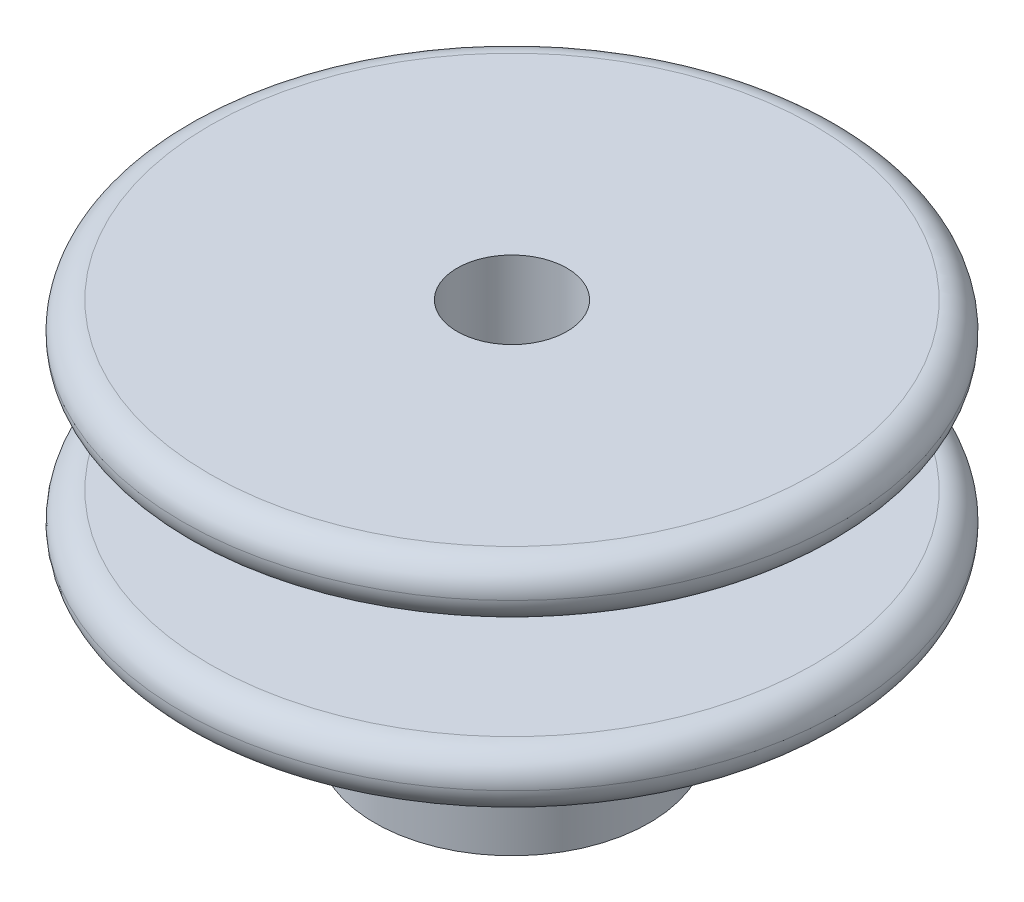
ISO-10303-21;
HEADER;
FILE_DESCRIPTION(('STEP AP214'),'2;1');
FILE_NAME('part.step','',(''),(''),'','','');
FILE_SCHEMA(('AUTOMOTIVE_DESIGN { 1 0 10303 214 1 1 1 1 }'));
ENDSEC;
DATA;
#1=APPLICATION_CONTEXT('core data for automotive mechanical design processes');
#2=APPLICATION_PROTOCOL_DEFINITION('international standard','automotive_design',2000,#1);
#3=PRODUCT_CONTEXT('',#1,'mechanical');
#4=PRODUCT('Part','Part','',(#3));
#5=PRODUCT_RELATED_PRODUCT_CATEGORY('part','',(#4));
#6=PRODUCT_DEFINITION_FORMATION('','',#4);
#7=PRODUCT_DEFINITION_CONTEXT('part definition',#1,'design');
#8=PRODUCT_DEFINITION('design','',#6,#7);
#9=PRODUCT_DEFINITION_SHAPE('','',#8);
#10=(LENGTH_UNIT() NAMED_UNIT(*) SI_UNIT(.MILLI.,.METRE.));
#11=(NAMED_UNIT(*) PLANE_ANGLE_UNIT() SI_UNIT($,.RADIAN.));
#12=(NAMED_UNIT(*) SI_UNIT($,.STERADIAN.) SOLID_ANGLE_UNIT());
#13=UNCERTAINTY_MEASURE_WITH_UNIT(LENGTH_MEASURE(1.E-05),#10,'distance_accuracy_value','');
#14=(GEOMETRIC_REPRESENTATION_CONTEXT(3) GLOBAL_UNCERTAINTY_ASSIGNED_CONTEXT((#13)) GLOBAL_UNIT_ASSIGNED_CONTEXT((#10,
#11,#12)) REPRESENTATION_CONTEXT('',''));
#15=CARTESIAN_POINT('',(0.,0.,0.));
#16=DIRECTION('',(0.,0.,1.));
#17=DIRECTION('',(1.,0.,0.));
#18=AXIS2_PLACEMENT_3D('',#15,#16,#17);
#19=CARTESIAN_POINT('',(0.,4.,0.));
#20=DIRECTION('',(0.,-1.,0.));
#21=DIRECTION('',(0.,0.,-1.));
#22=AXIS2_PLACEMENT_3D('',#19,#20,#21);
#23=CYLINDRICAL_SURFACE('',#22,5.);
#24=CARTESIAN_POINT('',(0.,4.,0.));
#25=DIRECTION('',(0.,1.,0.));
#26=DIRECTION('',(0.,0.,1.));
#27=AXIS2_PLACEMENT_3D('',#24,#25,#26);
#28=CIRCLE('',#27,5.);
#29=CARTESIAN_POINT('',(0.,4.,5.));
#30=VERTEX_POINT('',#29);
#31=EDGE_CURVE('E141',#30,#30,#28,.T.);
#32=ORIENTED_EDGE('',*,*,#31,.F.);
#33=EDGE_LOOP('',(#32));
#34=FACE_BOUND('',#33,.T.);
#35=CARTESIAN_POINT('',(0.,0.,0.));
#36=DIRECTION('',(0.,1.,0.));
#37=DIRECTION('',(0.,0.,1.));
#38=AXIS2_PLACEMENT_3D('',#35,#36,#37);
#39=CIRCLE('',#38,5.);
#40=CARTESIAN_POINT('',(0.,0.,5.));
#41=VERTEX_POINT('',#40);
#42=EDGE_CURVE('E138',#41,#41,#39,.T.);
#43=ORIENTED_EDGE('',*,*,#42,.T.);
#44=EDGE_LOOP('',(#43));
#45=FACE_BOUND('',#44,.T.);
#46=ADVANCED_FACE('F38',(#34,#45),#23,.T.);
#47=CARTESIAN_POINT('',(0.,6.,0.));
#48=DIRECTION('',(0.,1.,0.));
#49=DIRECTION('',(0.,0.,1.));
#50=AXIS2_PLACEMENT_3D('',#47,#48,#49);
#51=PLANE('',#50);
#52=CARTESIAN_POINT('',(0.,6.,0.));
#53=DIRECTION('',(0.,1.,0.));
#54=DIRECTION('',(0.,0.,1.));
#55=AXIS2_PLACEMENT_3D('',#52,#53,#54);
#56=CIRCLE('',#55,11.);
#57=CARTESIAN_POINT('',(0.,6.,11.));
#58=VERTEX_POINT('',#57);
#59=EDGE_CURVE('E51',#58,#58,#56,.T.);
#60=ORIENTED_EDGE('',*,*,#59,.T.);
#61=EDGE_LOOP('',(#60));
#62=FACE_BOUND('',#61,.T.);
#63=CARTESIAN_POINT('',(0.,6.,0.));
#64=DIRECTION('',(0.,-1.,0.));
#65=DIRECTION('',(0.,0.,-1.));
#66=AXIS2_PLACEMENT_3D('',#63,#64,#65);
#67=CIRCLE('',#66,2.);
#68=CARTESIAN_POINT('',(0.,6.,-2.));
#69=VERTEX_POINT('',#68);
#70=EDGE_CURVE('E78',#69,#69,#67,.T.);
#71=ORIENTED_EDGE('',*,*,#70,.T.);
#72=EDGE_LOOP('',(#71));
#73=FACE_BOUND('',#72,.T.);
#74=ADVANCED_FACE('F105',(#62,#73),#51,.T.);
#75=CARTESIAN_POINT('',(0.,4.,0.));
#76=DIRECTION('',(0.,1.,0.));
#77=DIRECTION('',(0.,0.,1.));
#78=AXIS2_PLACEMENT_3D('',#75,#76,#77);
#79=PLANE('',#78);
#80=CARTESIAN_POINT('',(0.,4.,0.));
#81=DIRECTION('',(0.,1.,0.));
#82=DIRECTION('',(0.,0.,1.));
#83=AXIS2_PLACEMENT_3D('',#80,#81,#82);
#84=CIRCLE('',#83,11.);
#85=CARTESIAN_POINT('',(0.,4.,11.));
#86=VERTEX_POINT('',#85);
#87=EDGE_CURVE('E56',#86,#86,#84,.F.);
#88=ORIENTED_EDGE('',*,*,#87,.T.);
#89=EDGE_LOOP('',(#88));
#90=FACE_BOUND('',#89,.T.);
#91=ORIENTED_EDGE('',*,*,#31,.T.);
#92=EDGE_LOOP('',(#91));
#93=FACE_BOUND('',#92,.T.);
#94=ADVANCED_FACE('F111',(#90,#93),#79,.F.);
#95=CARTESIAN_POINT('',(0.,-2.,0.));
#96=DIRECTION('',(0.,-1.,0.));
#97=DIRECTION('',(0.,0.,-1.));
#98=AXIS2_PLACEMENT_3D('',#95,#96,#97);
#99=PLANE('',#98);
#100=CARTESIAN_POINT('',(0.,-2.,0.));
#101=DIRECTION('',(0.,-1.,0.));
#102=DIRECTION('',(0.,0.,-1.));
#103=AXIS2_PLACEMENT_3D('',#100,#101,#102);
#104=CIRCLE('',#103,11.);
#105=CARTESIAN_POINT('',(0.,-2.,-11.));
#106=VERTEX_POINT('',#105);
#107=EDGE_CURVE('E10',#106,#106,#104,.T.);
#108=ORIENTED_EDGE('',*,*,#107,.T.);
#109=EDGE_LOOP('',(#108));
#110=FACE_BOUND('',#109,.T.);
#111=CARTESIAN_POINT('',(0.,-2.,0.));
#112=DIRECTION('',(0.,-1.,0.));
#113=DIRECTION('',(0.,0.,-1.));
#114=AXIS2_PLACEMENT_3D('',#111,#112,#113);
#115=CIRCLE('',#114,5.);
#116=CARTESIAN_POINT('',(0.,-2.,-5.));
#117=VERTEX_POINT('',#116);
#118=EDGE_CURVE('E135',#117,#117,#115,.T.);
#119=ORIENTED_EDGE('',*,*,#118,.F.);
#120=EDGE_LOOP('',(#119));
#121=FACE_BOUND('',#120,.T.);
#122=ADVANCED_FACE('F159',(#110,#121),#99,.T.);
#123=CARTESIAN_POINT('',(0.,0.,0.));
#124=DIRECTION('',(0.,-1.,0.));
#125=DIRECTION('',(0.,0.,-1.));
#126=AXIS2_PLACEMENT_3D('',#123,#124,#125);
#127=PLANE('',#126);
#128=CARTESIAN_POINT('',(0.,0.,0.));
#129=DIRECTION('',(0.,-1.,0.));
#130=DIRECTION('',(0.,0.,-1.));
#131=AXIS2_PLACEMENT_3D('',#128,#129,#130);
#132=CIRCLE('',#131,11.);
#133=CARTESIAN_POINT('',(0.,0.,-11.));
#134=VERTEX_POINT('',#133);
#135=EDGE_CURVE('E133',#134,#134,#132,.F.);
#136=ORIENTED_EDGE('',*,*,#135,.T.);
#137=EDGE_LOOP('',(#136));
#138=FACE_BOUND('',#137,.T.);
#139=ORIENTED_EDGE('',*,*,#42,.F.);
#140=EDGE_LOOP('',(#139));
#141=FACE_BOUND('',#140,.T.);
#142=ADVANCED_FACE('F101',(#138,#141),#127,.F.);
#143=CARTESIAN_POINT('',(0.,-8.,0.));
#144=DIRECTION('',(0.,1.,0.));
#145=DIRECTION('',(0.,0.,1.));
#146=AXIS2_PLACEMENT_3D('',#143,#144,#145);
#147=CYLINDRICAL_SURFACE('',#146,5.);
#148=CARTESIAN_POINT('',(1.,-4.,-4.89897948556636));
#149=CARTESIAN_POINT('',(0.999997945876045,-3.94443562451802,-4.89898059043933));
#150=CARTESIAN_POINT('',(0.995353171723656,-3.88884537669351,-4.89993508346913));
#151=CARTESIAN_POINT('',(0.976912283588335,-3.77923749488159,-4.90364431385263));
#152=CARTESIAN_POINT('',(0.963108847071181,-3.72522115536893,-4.90640049166333));
#153=CARTESIAN_POINT('',(0.926795782617738,-3.62036269663707,-4.91338873700356));
#154=CARTESIAN_POINT('',(0.904294814152082,-3.56951747846507,-4.91761933615313));
#155=CARTESIAN_POINT('',(0.851249107671043,-3.47232515530538,-4.92707799486421));
#156=CARTESIAN_POINT('',(0.820704818601296,-3.42597779946273,-4.93230599875014));
#157=CARTESIAN_POINT('',(0.75197907565329,-3.3384389961455,-4.9432529969268));
#158=CARTESIAN_POINT('',(0.713705655913279,-3.29732041211586,-4.94897737836825));
#159=CARTESIAN_POINT('',(0.630806789021349,-3.22204246642119,-4.9602247230302));
#160=CARTESIAN_POINT('',(0.586180896977995,-3.18788359258285,-4.96574767210945));
#161=CARTESIAN_POINT('',(0.491361355924245,-3.12721198237149,-4.97602796417448));
#162=CARTESIAN_POINT('',(0.441122567672208,-3.10076848618335,-4.9807782144152));
#163=CARTESIAN_POINT('',(0.336804150387274,-3.05672506295188,-4.98891736883662));
#164=CARTESIAN_POINT('',(0.282724881420554,-3.03912430809901,-4.99230640044127));
#165=CARTESIAN_POINT('',(0.173016773278493,-3.01349280638037,-4.9973032068841));
#166=CARTESIAN_POINT('',(0.117417739214814,-3.00533902242899,-4.99893386288125));
#167=CARTESIAN_POINT('',(0.0056185684375365,-2.99844904816169,-5.00030921183606));
#168=CARTESIAN_POINT('',(-0.050581509831843,-2.99971195035418,-5.00005408652759));
#169=CARTESIAN_POINT('',(-0.161142000743589,-3.01152618021555,-4.99770434868515));
#170=CARTESIAN_POINT('',(-0.21551721429847,-3.02194497716785,-4.99563598365838));
#171=CARTESIAN_POINT('',(-0.321731626580301,-3.05156503245889,-4.98992177159409));
#172=CARTESIAN_POINT('',(-0.373570723747129,-3.07076664219187,-4.98627586144039));
#173=CARTESIAN_POINT('',(-0.473619463200887,-3.11753004014727,-4.97777296019958));
#174=CARTESIAN_POINT('',(-0.5218041741339,-3.14514375110489,-4.97290848175223));
#175=CARTESIAN_POINT('',(-0.612905045859756,-3.2079090772366,-4.96250469473785));
#176=CARTESIAN_POINT('',(-0.655820599525001,-3.24306155977052,-4.95696530855222));
#177=CARTESIAN_POINT('',(-0.735951431053458,-3.32063362210847,-4.9457096436446));
#178=CARTESIAN_POINT('',(-0.773054316573632,-3.36316918672959,-4.93999196457516));
#179=CARTESIAN_POINT('',(-0.839618493176807,-3.45391644245075,-4.92911571598761));
#180=CARTESIAN_POINT('',(-0.86907963972775,-3.5021282408832,-4.92395715704548));
#181=CARTESIAN_POINT('',(-0.919562814801881,-3.6030208318218,-4.91478047472924));
#182=CARTESIAN_POINT('',(-0.940566647777709,-3.65571096763966,-4.91076481563549));
#183=CARTESIAN_POINT('',(-0.973390341627582,-3.76397132372399,-4.90436476321273));
#184=CARTESIAN_POINT('',(-0.985211399456642,-3.81954116761908,-4.90198015728428));
#185=CARTESIAN_POINT('',(-0.999166006036051,-3.93096485799904,-4.89915479267828));
#186=CARTESIAN_POINT('',(-1.00146185889791,-3.98679757431034,-4.89868147057154));
#187=CARTESIAN_POINT('',(-0.996737628310738,-4.09804822319968,-4.89964485688854));
#188=CARTESIAN_POINT('',(-0.989718073122442,-4.15346617911886,-4.90108145700388));
#189=CARTESIAN_POINT('',(-0.966702208074157,-4.26176864029224,-4.90567232494915));
#190=CARTESIAN_POINT('',(-0.950792620839298,-4.31467234303576,-4.90880999014497));
#191=CARTESIAN_POINT('',(-0.910541035308517,-4.41706327902874,-4.91643489351665));
#192=CARTESIAN_POINT('',(-0.886198342373177,-4.46655023043572,-4.9209222428627));
#193=CARTESIAN_POINT('',(-0.829404142215598,-4.56141310995016,-4.93081405962039));
#194=CARTESIAN_POINT('',(-0.796851077982754,-4.60672704630083,-4.93622971864903));
#195=CARTESIAN_POINT('',(-0.724695572212713,-4.69130831200092,-4.94733723826636));
#196=CARTESIAN_POINT('',(-0.685092405144537,-4.73057501824925,-4.95302912723818));
#197=CARTESIAN_POINT('',(-0.599232273497891,-4.80256255918558,-4.96415345869216));
#198=CARTESIAN_POINT('',(-0.55288249892963,-4.83517365465,-4.96958057708684));
#199=CARTESIAN_POINT('',(-0.455267896634755,-4.89214588149958,-4.9794712762862));
#200=CARTESIAN_POINT('',(-0.404003275433507,-4.91650735934478,-4.98393489755211));
#201=CARTESIAN_POINT('',(-0.298302680824013,-4.95612887174663,-4.99137294061067));
#202=CARTESIAN_POINT('',(-0.243886673478078,-4.97144051822625,-4.99435579142604));
#203=CARTESIAN_POINT('',(-0.133189454679913,-4.99269124766385,-4.9985323593766));
#204=CARTESIAN_POINT('',(-0.0769084687112145,-4.99863145947568,-4.99972629199843));
#205=CARTESIAN_POINT('',(0.034872893903623,-5.00092698096289,-5.00018540454121));
#206=CARTESIAN_POINT('',(0.0903698121415018,-4.99744728045621,-4.99948378549351));
#207=CARTESIAN_POINT('',(0.199971031315641,-4.98136604945219,-4.99630043560318));
#208=CARTESIAN_POINT('',(0.254075349753691,-4.96876463365193,-4.99381872714351));
#209=CARTESIAN_POINT('',(0.359252749745096,-4.93487100790836,-4.98735498365001));
#210=CARTESIAN_POINT('',(0.41033244324028,-4.91359862186882,-4.98337637247912));
#211=CARTESIAN_POINT('',(0.508221220185952,-4.8629877586691,-4.97434722123382));
#212=CARTESIAN_POINT('',(0.555029965767411,-4.83364864409628,-4.96929659645878));
#213=CARTESIAN_POINT('',(0.643863890106357,-4.76718061293792,-4.95857599157868));
#214=CARTESIAN_POINT('',(0.685799716116503,-4.72993366361323,-4.95289733422142));
#215=CARTESIAN_POINT('',(0.762882617756845,-4.64894975990423,-4.94161222903622));
#216=CARTESIAN_POINT('',(0.798028083202712,-4.60521127053126,-4.93600579862875));
#217=CARTESIAN_POINT('',(0.860892219455199,-4.51192068329982,-4.92543342749964));
#218=CARTESIAN_POINT('',(0.888526814639766,-4.46231103883964,-4.92047503631328));
#219=CARTESIAN_POINT('',(0.935024049287808,-4.35906722670031,-4.91185237184445));
#220=CARTESIAN_POINT('',(0.95389464597929,-4.30543676130208,-4.90818692536957));
#221=CARTESIAN_POINT('',(0.978669139854273,-4.20973754456343,-4.90329681128922));
#222=CARTESIAN_POINT('',(0.986653898522986,-4.16821458048854,-4.90168784915661));
#223=CARTESIAN_POINT('',(0.997320017960409,-4.08446604544636,-4.8995287845803));
#224=CARTESIAN_POINT('',(1.00000156156205,-4.04224049875183,-4.89897864563277));
#225=CARTESIAN_POINT('',(1.,-4.,-4.89897948556636));
#226=B_SPLINE_CURVE_WITH_KNOTS('',3,(#148,#149,#150,#151,#152,#153,#154,#155,#156,#157,#158,
#159,#160,#161,#162,#163,#164,#165,#166,#167,#168,#169,#170,#171,#172,#173,#174,#175,#176,#177,
#178,#179,#180,#181,#182,#183,#184,#185,#186,#187,#188,#189,#190,#191,#192,#193,#194,#195,#196,
#197,#198,#199,#200,#201,#202,#203,#204,#205,#206,#207,#208,#209,#210,#211,#212,#213,#214,#215,
#216,#217,#218,#219,#220,#221,#222,#223,#224,#225),.UNSPECIFIED.,.T.,.F.,(4,2,2,2,2,2,2,2,2,2,2,
2,2,2,2,2,2,2,2,2,2,2,2,2,2,2,2,2,2,2,2,2,2,2,2,2,2,2,4),(0.,0.166538463856524,
0.333210239259264,0.499716497915555,0.666213464834831,0.834822525459335,1.00344340032919,
1.17353400434947,1.34360868244057,1.51144248880577,1.67926012113745,1.84468789631034,
2.01012229071247,2.176599242198,2.34309535767563,2.5124934675998,2.68189478120217,
2.85165863170273,3.02140035013521,3.1882375780209,3.35506534525918,3.52029341780816,
3.68553510351895,3.85293059772018,4.02034332867706,4.19032601730948,4.36030156627601,
4.52929813576147,4.69827434689125,4.86431017412183,5.03034391364253,5.19600017072948,
5.36166952132181,5.53001152023093,5.69839338887278,5.86858898576538,6.03862975086429,
6.16523803634393,6.29184195681711),.UNSPECIFIED.);
#227=CARTESIAN_POINT('',(1.,-4.,-4.89897948556636));
#228=VERTEX_POINT('',#227);
#229=EDGE_CURVE('E65',#228,#228,#226,.T.);
#230=ORIENTED_EDGE('',*,*,#229,.T.);
#231=EDGE_LOOP('',(#230));
#232=FACE_BOUND('',#231,.T.);
#233=CARTESIAN_POINT('',(0.,-8.,0.));
#234=DIRECTION('',(0.,-1.,0.));
#235=DIRECTION('',(0.,0.,-1.));
#236=AXIS2_PLACEMENT_3D('',#233,#234,#235);
#237=CIRCLE('',#236,5.);
#238=CARTESIAN_POINT('',(0.,-8.,-5.));
#239=VERTEX_POINT('',#238);
#240=EDGE_CURVE('E142',#239,#239,#237,.T.);
#241=ORIENTED_EDGE('',*,*,#240,.F.);
#242=EDGE_LOOP('',(#241));
#243=FACE_BOUND('',#242,.T.);
#244=ORIENTED_EDGE('',*,*,#118,.T.);
#245=EDGE_LOOP('',(#244));
#246=FACE_BOUND('',#245,.T.);
#247=ADVANCED_FACE('F80',(#232,#243,#246),#147,.T.);
#248=CARTESIAN_POINT('',(0.,-8.,0.));
#249=DIRECTION('',(0.,-1.,0.));
#250=DIRECTION('',(0.,0.,-1.));
#251=AXIS2_PLACEMENT_3D('',#248,#249,#250);
#252=PLANE('',#251);
#253=CARTESIAN_POINT('',(0.,-8.,0.));
#254=DIRECTION('',(0.,-1.,0.));
#255=DIRECTION('',(0.,0.,-1.));
#256=AXIS2_PLACEMENT_3D('',#253,#254,#255);
#257=CIRCLE('',#256,2.);
#258=CARTESIAN_POINT('',(0.,-8.,-2.));
#259=VERTEX_POINT('',#258);
#260=EDGE_CURVE('E62',#259,#259,#257,.T.);
#261=ORIENTED_EDGE('',*,*,#260,.F.);
#262=EDGE_LOOP('',(#261));
#263=FACE_BOUND('',#262,.T.);
#264=ORIENTED_EDGE('',*,*,#240,.T.);
#265=EDGE_LOOP('',(#264));
#266=FACE_BOUND('',#265,.T.);
#267=ADVANCED_FACE('F94',(#263,#266),#252,.T.);
#268=CARTESIAN_POINT('',(0.,6.,0.));
#269=DIRECTION('',(0.,-1.,0.));
#270=DIRECTION('',(0.,0.,-1.));
#271=AXIS2_PLACEMENT_3D('',#268,#269,#270);
#272=CYLINDRICAL_SURFACE('',#271,2.);
#273=CARTESIAN_POINT('',(0.,-3.,-2.));
#274=CARTESIAN_POINT('',(0.0525719629529865,-3.0000033023195,-1.99999713404151));
#275=CARTESIAN_POINT('',(0.105206599698033,-3.00417007312168,-1.99790491019518));
#276=CARTESIAN_POINT('',(0.208920235268425,-3.02065288034092,-1.98974156037396));
#277=CARTESIAN_POINT('',(0.259996086713503,-3.03298439299765,-1.98366287828984));
#278=CARTESIAN_POINT('',(0.358933544880574,-3.0651938086168,-1.96816279403312));
#279=CARTESIAN_POINT('',(0.406806802939179,-3.08504238424801,-1.9587543917752));
#280=CARTESIAN_POINT('',(0.498472616806564,-3.13157062136494,-1.93745776515779));
#281=CARTESIAN_POINT('',(0.542265493990049,-3.15824974424885,-1.9255697363353));
#282=CARTESIAN_POINT('',(0.627507817761918,-3.2195172494853,-1.89956258258057));
#283=CARTESIAN_POINT('',(0.668655211122111,-3.25448647923964,-1.88535199127536));
#284=CARTESIAN_POINT('',(0.744779444866977,-3.33052147924703,-1.85659970246744));
#285=CARTESIAN_POINT('',(0.779751583106766,-3.37159185177244,-1.84205776209035));
#286=CARTESIAN_POINT('',(0.845252000450278,-3.46248334952338,-1.81298951197347));
#287=CARTESIAN_POINT('',(0.875225335551636,-3.51273609834591,-1.79855186970132));
#288=CARTESIAN_POINT('',(0.926168226890695,-3.61836733598621,-1.77285978772321));
#289=CARTESIAN_POINT('',(0.947144214966333,-3.67374212872275,-1.7616030760699));
#290=CARTESIAN_POINT('',(0.978132442188588,-3.78466510542192,-1.74457867037809));
#291=CARTESIAN_POINT('',(0.988725857080441,-3.84000445206739,-1.73852271583714));
#292=CARTESIAN_POINT('',(1.00042699330885,-3.95197883777948,-1.73181889948528));
#293=CARTESIAN_POINT('',(1.00154408837307,-4.00861254087115,-1.73116569343288));
#294=CARTESIAN_POINT('',(0.994687287172294,-4.11428602431537,-1.73510930257248));
#295=CARTESIAN_POINT('',(0.987784559536822,-4.16342403122305,-1.73908763662014));
#296=CARTESIAN_POINT('',(0.966939849056932,-4.25972190937304,-1.7507622873385));
#297=CARTESIAN_POINT('',(0.952995623897652,-4.30688114530532,-1.75845978831776));
#298=CARTESIAN_POINT('',(0.918209780386004,-4.39922913256566,-1.77687476412741));
#299=CARTESIAN_POINT('',(0.897215067115995,-4.44434639878579,-1.78765840663999));
#300=CARTESIAN_POINT('',(0.849041687668002,-4.53063429259001,-1.81103404281404));
#301=CARTESIAN_POINT('',(0.821860243812467,-4.57180313560009,-1.82362684780191));
#302=CARTESIAN_POINT('',(0.758066054912788,-4.65452125274323,-1.85113157903286));
#303=CARTESIAN_POINT('',(0.720694458369282,-4.69545687357616,-1.86613510236746));
#304=CARTESIAN_POINT('',(0.639555578741373,-4.7707354185909,-1.89547623300407));
#305=CARTESIAN_POINT('',(0.595785256574285,-4.80507519203388,-1.90981351958801));
#306=CARTESIAN_POINT('',(0.500516505831848,-4.86768566102973,-1.93701987282964));
#307=CARTESIAN_POINT('',(0.448753591599408,-4.89560047244574,-1.94978984162007));
#308=CARTESIAN_POINT('',(0.340466215488797,-4.94209702904301,-1.97157881121242));
#309=CARTESIAN_POINT('',(0.283945576265276,-4.96068618501517,-1.98060078943553));
#310=CARTESIAN_POINT('',(0.172766491660701,-4.98647540371668,-1.99324333741436));
#311=CARTESIAN_POINT('',(0.118341530548324,-4.99449123574678,-1.99724938301312));
#312=CARTESIAN_POINT('',(0.00877959994935387,-5.00146473113449,-2.00073013459102));
#313=CARTESIAN_POINT('',(-0.0463570198699011,-5.00042668563948,-2.00020698721312));
#314=CARTESIAN_POINT('',(-0.151232971985993,-4.98979331158125,-1.99491192253441));
#315=CARTESIAN_POINT('',(-0.201059408049954,-4.98086746726997,-1.9904724568819));
#316=CARTESIAN_POINT('',(-0.298406892301916,-4.95576192810491,-1.97822171314819));
#317=CARTESIAN_POINT('',(-0.345927685690996,-4.93958143354664,-1.97041006334332));
#318=CARTESIAN_POINT('',(-0.438888608449665,-4.90000153356683,-1.95184251413669));
#319=CARTESIAN_POINT('',(-0.484230397006153,-4.87640894988319,-1.94100881769939));
#320=CARTESIAN_POINT('',(-0.570461361698921,-4.82289246435396,-1.91743974317109));
#321=CARTESIAN_POINT('',(-0.611348629775281,-4.79296586540657,-1.90470355565785));
#322=CARTESIAN_POINT('',(-0.691767689290652,-4.72423957466713,-1.87708221337464));
#323=CARTESIAN_POINT('',(-0.730772077824638,-4.68485713154644,-1.86210884848441));
#324=CARTESIAN_POINT('',(-0.801856321113238,-4.6000748487307,-1.83262391603874));
#325=CARTESIAN_POINT('',(-0.83393138569084,-4.55467088118363,-1.81811267381526));
#326=CARTESIAN_POINT('',(-0.891707914497695,-4.45635634579969,-1.79051192226068));
#327=CARTESIAN_POINT('',(-0.917025495878637,-4.40318873379141,-1.77752529663472));
#328=CARTESIAN_POINT('',(-0.958082826013802,-4.29248993230748,-1.75574072368126));
#329=CARTESIAN_POINT('',(-0.97383491588757,-4.23496447349881,-1.74693738240618));
#330=CARTESIAN_POINT('',(-0.993861687449679,-4.12308977713855,-1.73561501008667));
#331=CARTESIAN_POINT('',(-0.999092996400865,-4.06896574657097,-1.73257383460491));
#332=CARTESIAN_POINT('',(-1.00068915438079,-3.96055293282927,-1.73165354646175));
#333=CARTESIAN_POINT('',(-0.997057846624399,-3.90626423126057,-1.73377219627553));
#334=CARTESIAN_POINT('',(-0.981926125592263,-3.80451649846799,-1.74237862050025));
#335=CARTESIAN_POINT('',(-0.9712083143428,-3.7568995298556,-1.74843094482394));
#336=CARTESIAN_POINT('',(-0.943175358224645,-3.66419188057529,-1.76371016187917));
#337=CARTESIAN_POINT('',(-0.92585809115981,-3.61910201790803,-1.77293807569676));
#338=CARTESIAN_POINT('',(-0.883815745300683,-3.52937514901339,-1.79428530364528));
#339=CARTESIAN_POINT('',(-0.858671137816458,-3.4849720981703,-1.80655722396191));
#340=CARTESIAN_POINT('',(-0.802150971636634,-3.40072546381941,-1.8323533163459));
#341=CARTESIAN_POINT('',(-0.770772171238648,-3.36088426948151,-1.84587813794522));
#342=CARTESIAN_POINT('',(-0.698203326664641,-3.28185801764238,-1.87462323159313));
#343=CARTESIAN_POINT('',(-0.656284423010171,-3.24334089763808,-1.88984983311469));
#344=CARTESIAN_POINT('',(-0.566154806220279,-3.17373701657637,-1.91877752255088));
#345=CARTESIAN_POINT('',(-0.517940723256785,-3.14265426057371,-1.9324777860804));
#346=CARTESIAN_POINT('',(-0.415931596819946,-3.0887636372378,-1.95698009585103));
#347=CARTESIAN_POINT('',(-0.362099503934614,-3.06601583058857,-1.96776096562909));
#348=CARTESIAN_POINT('',(-0.250742101294191,-3.03019183208105,-1.98501341363465));
#349=CARTESIAN_POINT('',(-0.193227799623166,-3.01708815317042,-1.99149723372932));
#350=CARTESIAN_POINT('',(-0.112601946483384,-3.00610258892415,-1.99695461909663));
#351=CARTESIAN_POINT('',(-0.0901618794394989,-3.00381735913638,-1.99809365339202));
#352=CARTESIAN_POINT('',(-0.0451517318071579,-3.00076533448319,-1.99961696977865));
#353=CARTESIAN_POINT('',(-0.0225816476473815,-2.9999985815288,-2.00000123103763));
#354=CARTESIAN_POINT('',(0.,-3.,-2.));
#355=B_SPLINE_CURVE_WITH_KNOTS('',3,(#273,#274,#275,#276,#277,#278,#279,#280,#281,#282,#283,
#284,#285,#286,#287,#288,#289,#290,#291,#292,#293,#294,#295,#296,#297,#298,#299,#300,#301,#302,
#303,#304,#305,#306,#307,#308,#309,#310,#311,#312,#313,#314,#315,#316,#317,#318,#319,#320,#321,
#322,#323,#324,#325,#326,#327,#328,#329,#330,#331,#332,#333,#334,#335,#336,#337,#338,#339,#340,
#341,#342,#343,#344,#345,#346,#347,#348,#349,#350,#351,#352,#353,#354),.UNSPECIFIED.,.T.,.F.,(4,
2,2,2,2,2,2,2,2,2,2,2,2,2,2,2,2,2,2,2,2,2,2,2,2,2,2,2,2,2,2,2,2,2,2,2,2,2,2,2,4),(0.,
0.157624257420292,0.315548149709197,0.472862155492297,0.630163760581566,0.796981758718088,
0.963926237654034,1.14381726430752,1.32357947898281,1.49258012140229,1.6614135732902,
1.81005712409321,1.95874803925678,2.11090240168487,2.26312521260222,2.43464941333878,
2.60625534598686,2.78583022214441,2.9652621691228,3.12983290471346,3.29432564511476,
3.44606906506122,3.59782921630931,3.75392856027899,3.91009450748339,4.08159610644419,
4.25321588615432,4.43314682159674,4.61284511940778,4.77529307498373,4.93767059860005,
5.08457930244183,5.23153528783678,5.38836456775614,5.54527561138958,5.72125242752498,
5.89732383376573,6.07464013662925,6.2514490862493,6.31915280137698,6.38685838514847),.UNSPECIFIED.);
#356=CARTESIAN_POINT('',(0.,-3.,-2.));
#357=VERTEX_POINT('',#356);
#358=EDGE_CURVE('E42',#357,#357,#355,.T.);
#359=ORIENTED_EDGE('',*,*,#358,.T.);
#360=EDGE_LOOP('',(#359));
#361=FACE_BOUND('',#360,.T.);
#362=ORIENTED_EDGE('',*,*,#70,.F.);
#363=EDGE_LOOP('',(#362));
#364=FACE_BOUND('',#363,.T.);
#365=ORIENTED_EDGE('',*,*,#260,.T.);
#366=EDGE_LOOP('',(#365));
#367=FACE_BOUND('',#366,.T.);
#368=ADVANCED_FACE('F89',(#361,#364,#367),#272,.F.);
#369=CARTESIAN_POINT('',(0.,-1.,0.));
#370=DIRECTION('',(0.,-1.,0.));
#371=DIRECTION('',(0.,0.,-1.));
#372=AXIS2_PLACEMENT_3D('',#369,#370,#371);
#373=TOROIDAL_SURFACE('',#372,11.,1.);
#374=ORIENTED_EDGE('',*,*,#107,.F.);
#375=EDGE_LOOP('',(#374));
#376=FACE_BOUND('',#375,.T.);
#377=CARTESIAN_POINT('',(0.,-1.,0.));
#378=DIRECTION('',(0.,-1.,0.));
#379=DIRECTION('',(0.,0.,-1.));
#380=AXIS2_PLACEMENT_3D('',#377,#378,#379);
#381=CIRCLE('',#380,12.);
#382=CARTESIAN_POINT('',(0.,-1.,-12.));
#383=VERTEX_POINT('',#382);
#384=EDGE_CURVE('E60',#383,#383,#381,.F.);
#385=ORIENTED_EDGE('',*,*,#384,.F.);
#386=EDGE_LOOP('',(#385));
#387=FACE_BOUND('',#386,.T.);
#388=ADVANCED_FACE('F93',(#376,#387),#373,.T.);
#389=CARTESIAN_POINT('',(0.,-1.,0.));
#390=DIRECTION('',(0.,-1.,0.));
#391=DIRECTION('',(0.,0.,-1.));
#392=AXIS2_PLACEMENT_3D('',#389,#390,#391);
#393=TOROIDAL_SURFACE('',#392,11.,1.);
#394=ORIENTED_EDGE('',*,*,#135,.F.);
#395=EDGE_LOOP('',(#394));
#396=FACE_BOUND('',#395,.T.);
#397=ORIENTED_EDGE('',*,*,#384,.T.);
#398=EDGE_LOOP('',(#397));
#399=FACE_BOUND('',#398,.T.);
#400=ADVANCED_FACE('F118',(#396,#399),#393,.T.);
#401=CARTESIAN_POINT('',(0.,5.,0.));
#402=DIRECTION('',(0.,1.,0.));
#403=DIRECTION('',(0.,0.,1.));
#404=AXIS2_PLACEMENT_3D('',#401,#402,#403);
#405=TOROIDAL_SURFACE('',#404,11.,1.);
#406=ORIENTED_EDGE('',*,*,#59,.F.);
#407=EDGE_LOOP('',(#406));
#408=FACE_BOUND('',#407,.T.);
#409=CARTESIAN_POINT('',(0.,5.,0.));
#410=DIRECTION('',(0.,1.,0.));
#411=DIRECTION('',(0.,0.,1.));
#412=AXIS2_PLACEMENT_3D('',#409,#410,#411);
#413=CIRCLE('',#412,12.);
#414=CARTESIAN_POINT('',(0.,5.,12.));
#415=VERTEX_POINT('',#414);
#416=EDGE_CURVE('E63',#415,#415,#413,.F.);
#417=ORIENTED_EDGE('',*,*,#416,.F.);
#418=EDGE_LOOP('',(#417));
#419=FACE_BOUND('',#418,.T.);
#420=ADVANCED_FACE('F40',(#408,#419),#405,.T.);
#421=CARTESIAN_POINT('',(0.,5.,0.));
#422=DIRECTION('',(0.,1.,0.));
#423=DIRECTION('',(0.,0.,1.));
#424=AXIS2_PLACEMENT_3D('',#421,#422,#423);
#425=TOROIDAL_SURFACE('',#424,11.,1.);
#426=ORIENTED_EDGE('',*,*,#87,.F.);
#427=EDGE_LOOP('',(#426));
#428=FACE_BOUND('',#427,.T.);
#429=ORIENTED_EDGE('',*,*,#416,.T.);
#430=EDGE_LOOP('',(#429));
#431=FACE_BOUND('',#430,.T.);
#432=ADVANCED_FACE('F87',(#428,#431),#425,.T.);
#433=CARTESIAN_POINT('',(0.,-4.,-12.));
#434=DIRECTION('',(0.,0.,1.));
#435=DIRECTION('',(1.,0.,0.));
#436=AXIS2_PLACEMENT_3D('',#433,#434,#435);
#437=CYLINDRICAL_SURFACE('',#436,1.);
#438=ORIENTED_EDGE('',*,*,#358,.F.);
#439=EDGE_LOOP('',(#438));
#440=FACE_BOUND('',#439,.T.);
#441=ORIENTED_EDGE('',*,*,#229,.F.);
#442=EDGE_LOOP('',(#441));
#443=FACE_BOUND('',#442,.T.);
#444=ADVANCED_FACE('F84',(#440,#443),#437,.F.);
#445=CLOSED_SHELL('',(#46,#74,#94,#122,#142,#247,#267,#368,#388,#400,#420,#432,#444));
#446=MANIFOLD_SOLID_BREP('B2',#445);
#447=ADVANCED_BREP_SHAPE_REPRESENTATION('',(#18,#446),#14);
#448=SHAPE_DEFINITION_REPRESENTATION(#9,#447);
ENDSEC;
END-ISO-10303-21;
